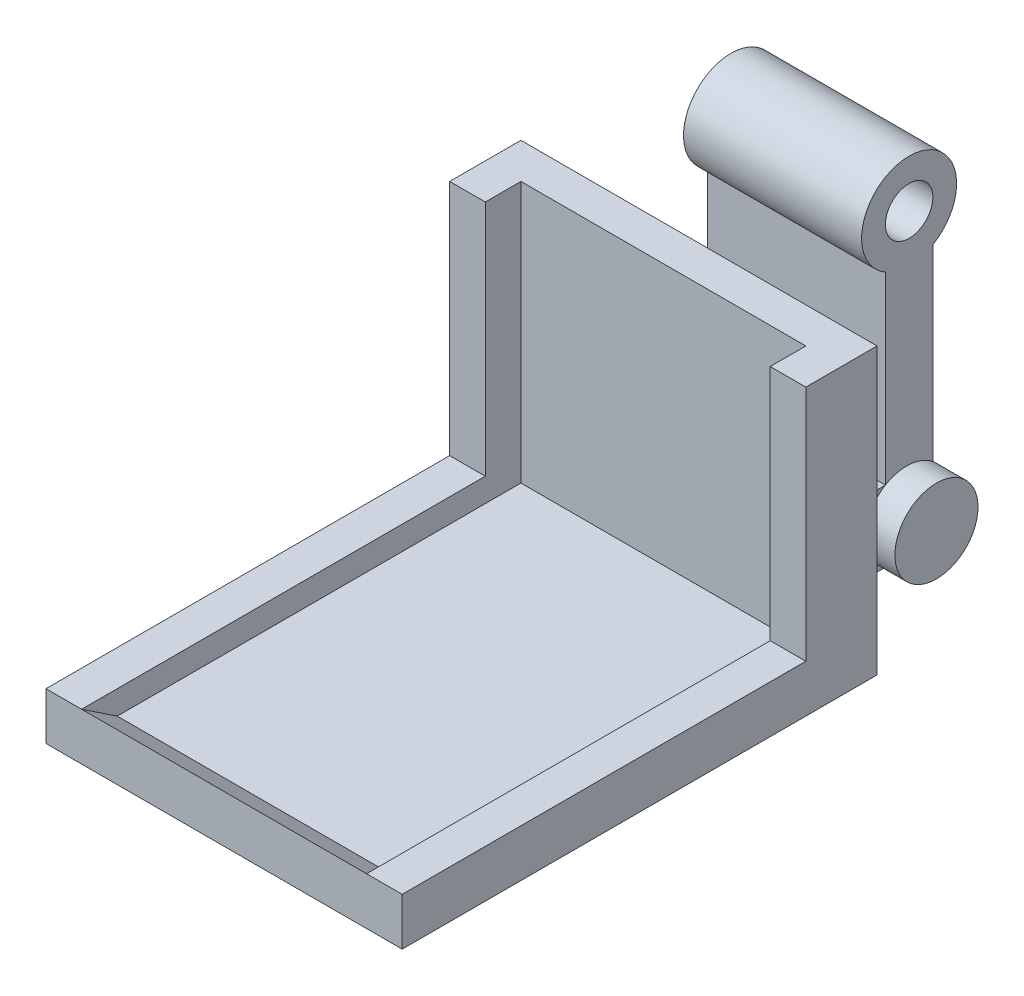
ISO-10303-21;
HEADER;
FILE_DESCRIPTION(('STEP AP214'),'2;1');
FILE_NAME('part.step','',(''),(''),'','','');
FILE_SCHEMA(('AUTOMOTIVE_DESIGN { 1 0 10303 214 1 1 1 1 }'));
ENDSEC;
DATA;
#1=APPLICATION_CONTEXT('core data for automotive mechanical design processes');
#2=APPLICATION_PROTOCOL_DEFINITION('international standard','automotive_design',2000,#1);
#3=PRODUCT_CONTEXT('',#1,'mechanical');
#4=PRODUCT('Part','Part','',(#3));
#5=PRODUCT_RELATED_PRODUCT_CATEGORY('part','',(#4));
#6=PRODUCT_DEFINITION_FORMATION('','',#4);
#7=PRODUCT_DEFINITION_CONTEXT('part definition',#1,'design');
#8=PRODUCT_DEFINITION('design','',#6,#7);
#9=PRODUCT_DEFINITION_SHAPE('','',#8);
#10=(LENGTH_UNIT() NAMED_UNIT(*) SI_UNIT(.MILLI.,.METRE.));
#11=(NAMED_UNIT(*) PLANE_ANGLE_UNIT() SI_UNIT($,.RADIAN.));
#12=(NAMED_UNIT(*) SI_UNIT($,.STERADIAN.) SOLID_ANGLE_UNIT());
#13=UNCERTAINTY_MEASURE_WITH_UNIT(LENGTH_MEASURE(1.E-05),#10,'distance_accuracy_value','');
#14=(GEOMETRIC_REPRESENTATION_CONTEXT(3) GLOBAL_UNCERTAINTY_ASSIGNED_CONTEXT((#13)) GLOBAL_UNIT_ASSIGNED_CONTEXT((#10,
#11,#12)) REPRESENTATION_CONTEXT('',''));
#15=CARTESIAN_POINT('',(0.,0.,0.));
#16=DIRECTION('',(0.,0.,1.));
#17=DIRECTION('',(1.,0.,0.));
#18=AXIS2_PLACEMENT_3D('',#15,#16,#17);
#19=CARTESIAN_POINT('',(10.,0.,0.));
#20=DIRECTION('',(-1.,0.,0.));
#21=DIRECTION('',(0.,0.,1.));
#22=AXIS2_PLACEMENT_3D('',#19,#20,#21);
#23=CYLINDRICAL_SURFACE('',#22,1.75);
#24=CARTESIAN_POINT('',(10.,0.,0.));
#25=DIRECTION('',(1.,0.,0.));
#26=DIRECTION('',(0.,0.,-1.));
#27=AXIS2_PLACEMENT_3D('',#24,#25,#26);
#28=CIRCLE('',#27,1.75);
#29=CARTESIAN_POINT('',(10.,0.,-1.75));
#30=VERTEX_POINT('',#29);
#31=EDGE_CURVE('E192',#30,#30,#28,.T.);
#32=ORIENTED_EDGE('',*,*,#31,.F.);
#33=EDGE_LOOP('',(#32));
#34=FACE_BOUND('',#33,.T.);
#35=CARTESIAN_POINT('',(0.,0.,0.));
#36=DIRECTION('',(1.,0.,0.));
#37=DIRECTION('',(0.,0.,-1.));
#38=AXIS2_PLACEMENT_3D('',#35,#36,#37);
#39=CIRCLE('',#38,1.75);
#40=CARTESIAN_POINT('',(0.,0.,-1.75));
#41=VERTEX_POINT('',#40);
#42=EDGE_CURVE('E227',#41,#41,#39,.T.);
#43=ORIENTED_EDGE('',*,*,#42,.T.);
#44=EDGE_LOOP('',(#43));
#45=FACE_BOUND('',#44,.T.);
#46=CARTESIAN_POINT('',(1.25,0.,0.));
#47=DIRECTION('',(1.,0.,0.));
#48=DIRECTION('',(0.,0.,-1.));
#49=AXIS2_PLACEMENT_3D('',#46,#47,#48);
#50=CIRCLE('',#49,1.75);
#51=CARTESIAN_POINT('',(1.25,1.36218621174346,-1.09861218113401));
#52=VERTEX_POINT('',#51);
#53=CARTESIAN_POINT('',(1.25,1.5,0.901387818865995));
#54=VERTEX_POINT('',#53);
#55=EDGE_CURVE('E11',#52,#54,#50,.T.);
#56=ORIENTED_EDGE('',*,*,#55,.F.);
#57=DIRECTION('',(-1.,0.,0.));
#58=VECTOR('',#57,1.);
#59=CARTESIAN_POINT('',(10.,1.36218621174346,-1.09861218113401));
#60=LINE('',#59,#58);
#61=CARTESIAN_POINT('',(8.75,1.36218621174346,-1.09861218113401));
#62=VERTEX_POINT('',#61);
#63=EDGE_CURVE('E198',#62,#52,#60,.T.);
#64=ORIENTED_EDGE('',*,*,#63,.F.);
#65=CARTESIAN_POINT('',(8.75,0.,0.));
#66=DIRECTION('',(-1.,0.,0.));
#67=DIRECTION('',(0.,0.,1.));
#68=AXIS2_PLACEMENT_3D('',#65,#66,#67);
#69=CIRCLE('',#68,1.75);
#70=CARTESIAN_POINT('',(8.75,1.5,0.901387818865994));
#71=VERTEX_POINT('',#70);
#72=EDGE_CURVE('E48',#71,#62,#69,.T.);
#73=ORIENTED_EDGE('',*,*,#72,.F.);
#74=CARTESIAN_POINT('',(8.75,0.,0.));
#75=DIRECTION('',(-1.,0.,0.));
#76=DIRECTION('',(0.,0.,1.));
#77=AXIS2_PLACEMENT_3D('',#74,#75,#76);
#78=CIRCLE('',#77,1.75);
#79=CARTESIAN_POINT('',(8.75,-1.5,0.901387818866004));
#80=VERTEX_POINT('',#79);
#81=EDGE_CURVE('E191',#80,#71,#78,.T.);
#82=ORIENTED_EDGE('',*,*,#81,.F.);
#83=DIRECTION('',(-1.,0.,0.));
#84=VECTOR('',#83,1.);
#85=CARTESIAN_POINT('',(10.,-1.5,0.901387818866005));
#86=LINE('',#85,#84);
#87=CARTESIAN_POINT('',(1.25,-1.5,0.901387818866005));
#88=VERTEX_POINT('',#87);
#89=EDGE_CURVE('E210',#88,#80,#86,.F.);
#90=ORIENTED_EDGE('',*,*,#89,.F.);
#91=CARTESIAN_POINT('',(1.25,0.,0.));
#92=DIRECTION('',(1.,0.,0.));
#93=DIRECTION('',(0.,0.,-1.));
#94=AXIS2_PLACEMENT_3D('',#91,#92,#93);
#95=CIRCLE('',#94,1.75);
#96=EDGE_CURVE('E236',#54,#88,#95,.T.);
#97=ORIENTED_EDGE('',*,*,#96,.F.);
#98=EDGE_LOOP('',(#56,#64,#73,#82,#90,#97));
#99=FACE_BOUND('',#98,.T.);
#100=ADVANCED_FACE('F39',(#34,#45,#99),#23,.T.);
#101=CARTESIAN_POINT('',(-2.5,0.500000000000001,25.));
#102=DIRECTION('',(0.,-1.,0.));
#103=DIRECTION('',(1.,0.,0.));
#104=AXIS2_PLACEMENT_3D('',#101,#102,#103);
#105=PLANE('',#104);
#106=DIRECTION('',(1.,0.,0.));
#107=VECTOR('',#106,1.);
#108=CARTESIAN_POINT('',(-1.,0.500000000000001,8.));
#109=LINE('',#108,#107);
#110=CARTESIAN_POINT('',(-2.5,0.500000000000001,8.));
#111=VERTEX_POINT('',#110);
#112=CARTESIAN_POINT('',(-1.,0.500000000000001,8.));
#113=VERTEX_POINT('',#112);
#114=EDGE_CURVE('E259',#111,#113,#109,.T.);
#115=ORIENTED_EDGE('',*,*,#114,.F.);
#116=DIRECTION('',(0.,0.,-1.));
#117=VECTOR('',#116,1.);
#118=CARTESIAN_POINT('',(-2.5,0.500000000000001,25.));
#119=LINE('',#118,#117);
#120=CARTESIAN_POINT('',(-2.5,0.500000000000001,25.));
#121=VERTEX_POINT('',#120);
#122=EDGE_CURVE('E366',#121,#111,#119,.T.);
#123=ORIENTED_EDGE('',*,*,#122,.F.);
#124=DIRECTION('',(-1.,0.,0.));
#125=VECTOR('',#124,1.);
#126=CARTESIAN_POINT('',(-2.5,0.500000000000001,25.));
#127=LINE('',#126,#125);
#128=CARTESIAN_POINT('',(-1.,0.499999999999996,25.));
#129=VERTEX_POINT('',#128);
#130=EDGE_CURVE('E361',#129,#121,#127,.T.);
#131=ORIENTED_EDGE('',*,*,#130,.F.);
#132=DIRECTION('',(0.,0.,1.));
#133=VECTOR('',#132,1.);
#134=CARTESIAN_POINT('',(-1.,0.500000000000001,6.5));
#135=LINE('',#134,#133);
#136=EDGE_CURVE('E320',#113,#129,#135,.T.);
#137=ORIENTED_EDGE('',*,*,#136,.F.);
#138=EDGE_LOOP('',(#115,#123,#131,#137));
#139=FACE_BOUND('',#138,.T.);
#140=ADVANCED_FACE('F425',(#139),#105,.F.);
#141=DIRECTION('',(1.,0.,0.));
#142=VECTOR('',#141,1.);
#143=CARTESIAN_POINT('',(12.5,0.500000000000004,8.));
#144=LINE('',#143,#142);
#145=CARTESIAN_POINT('',(11.,0.500000000000003,8.));
#146=VERTEX_POINT('',#145);
#147=CARTESIAN_POINT('',(12.5,0.500000000000004,8.));
#148=VERTEX_POINT('',#147);
#149=EDGE_CURVE('E265',#146,#148,#144,.T.);
#150=ORIENTED_EDGE('',*,*,#149,.F.);
#151=DIRECTION('',(0.,0.,-1.));
#152=VECTOR('',#151,1.);
#153=CARTESIAN_POINT('',(11.,0.500000000000003,6.5));
#154=LINE('',#153,#152);
#155=CARTESIAN_POINT('',(11.,0.499999999999998,25.));
#156=VERTEX_POINT('',#155);
#157=EDGE_CURVE('E326',#156,#146,#154,.T.);
#158=ORIENTED_EDGE('',*,*,#157,.F.);
#159=CARTESIAN_POINT('',(12.5,0.500000000000004,25.));
#160=VERTEX_POINT('',#159);
#161=EDGE_CURVE('E362',#160,#156,#127,.T.);
#162=ORIENTED_EDGE('',*,*,#161,.F.);
#163=DIRECTION('',(0.,0.,-1.));
#164=VECTOR('',#163,1.);
#165=CARTESIAN_POINT('',(12.5,0.500000000000004,25.));
#166=LINE('',#165,#164);
#167=EDGE_CURVE('E380',#160,#148,#166,.T.);
#168=ORIENTED_EDGE('',*,*,#167,.T.);
#169=EDGE_LOOP('',(#150,#158,#162,#168));
#170=FACE_BOUND('',#169,.T.);
#171=ADVANCED_FACE('F462',(#170),#105,.F.);
#172=CARTESIAN_POINT('',(10.,0.,0.));
#173=DIRECTION('',(1.,0.,0.));
#174=DIRECTION('',(0.,0.,-1.));
#175=AXIS2_PLACEMENT_3D('',#172,#173,#174);
#176=PLANE('',#175);
#177=ORIENTED_EDGE('',*,*,#31,.T.);
#178=EDGE_LOOP('',(#177));
#179=FACE_BOUND('',#178,.T.);
#180=ADVANCED_FACE('F464',(#179),#176,.T.);
#181=CARTESIAN_POINT('',(0.,0.,0.));
#182=DIRECTION('',(1.,0.,0.));
#183=DIRECTION('',(0.,0.,-1.));
#184=AXIS2_PLACEMENT_3D('',#181,#182,#183);
#185=PLANE('',#184);
#186=ORIENTED_EDGE('',*,*,#42,.F.);
#187=EDGE_LOOP('',(#186));
#188=FACE_BOUND('',#187,.T.);
#189=ADVANCED_FACE('F470',(#188),#185,.F.);
#190=CARTESIAN_POINT('',(1.25,-1.5,5.));
#191=DIRECTION('',(0.,1.,0.));
#192=DIRECTION('',(-1.,0.,0.));
#193=AXIS2_PLACEMENT_3D('',#190,#191,#192);
#194=PLANE('',#193);
#195=DIRECTION('',(0.,0.,-1.));
#196=VECTOR('',#195,1.);
#197=CARTESIAN_POINT('',(1.25,-1.5,5.));
#198=LINE('',#197,#196);
#199=CARTESIAN_POINT('',(1.25,-1.5,5.));
#200=VERTEX_POINT('',#199);
#201=EDGE_CURVE('E219',#200,#88,#198,.T.);
#202=ORIENTED_EDGE('',*,*,#201,.T.);
#203=ORIENTED_EDGE('',*,*,#89,.T.);
#204=DIRECTION('',(0.,0.,-1.));
#205=VECTOR('',#204,1.);
#206=CARTESIAN_POINT('',(8.75,-1.5,5.));
#207=LINE('',#206,#205);
#208=CARTESIAN_POINT('',(8.75,-1.5,5.));
#209=VERTEX_POINT('',#208);
#210=EDGE_CURVE('E208',#209,#80,#207,.T.);
#211=ORIENTED_EDGE('',*,*,#210,.F.);
#212=DIRECTION('',(1.,0.,0.));
#213=VECTOR('',#212,1.);
#214=CARTESIAN_POINT('',(-2.5,-1.5,5.));
#215=LINE('',#214,#213);
#216=CARTESIAN_POINT('',(12.5,-1.5,5.));
#217=VERTEX_POINT('',#216);
#218=EDGE_CURVE('E370',#209,#217,#215,.T.);
#219=ORIENTED_EDGE('',*,*,#218,.T.);
#220=DIRECTION('',(0.,0.,-1.));
#221=VECTOR('',#220,1.);
#222=CARTESIAN_POINT('',(12.5,-1.5,25.));
#223=LINE('',#222,#221);
#224=CARTESIAN_POINT('',(12.5,-1.5,25.));
#225=VERTEX_POINT('',#224);
#226=EDGE_CURVE('E384',#225,#217,#223,.T.);
#227=ORIENTED_EDGE('',*,*,#226,.F.);
#228=DIRECTION('',(1.,0.,0.));
#229=VECTOR('',#228,1.);
#230=CARTESIAN_POINT('',(-2.5,-1.5,25.));
#231=LINE('',#230,#229);
#232=CARTESIAN_POINT('',(-2.5,-1.5,25.));
#233=VERTEX_POINT('',#232);
#234=EDGE_CURVE('E354',#233,#225,#231,.T.);
#235=ORIENTED_EDGE('',*,*,#234,.F.);
#236=DIRECTION('',(0.,0.,-1.));
#237=VECTOR('',#236,1.);
#238=CARTESIAN_POINT('',(-2.5,-1.5,25.));
#239=LINE('',#238,#237);
#240=CARTESIAN_POINT('',(-2.5,-1.5,5.));
#241=VERTEX_POINT('',#240);
#242=EDGE_CURVE('E388',#233,#241,#239,.T.);
#243=ORIENTED_EDGE('',*,*,#242,.T.);
#244=EDGE_CURVE('E371',#241,#200,#215,.T.);
#245=ORIENTED_EDGE('',*,*,#244,.T.);
#246=EDGE_LOOP('',(#202,#203,#211,#219,#227,#235,#243,#245));
#247=FACE_BOUND('',#246,.T.);
#248=ADVANCED_FACE('F406',(#247),#194,.F.);
#249=CARTESIAN_POINT('',(1.25,1.5,5.));
#250=DIRECTION('',(0.,-1.,0.));
#251=DIRECTION('',(1.,0.,0.));
#252=AXIS2_PLACEMENT_3D('',#249,#250,#251);
#253=PLANE('',#252);
#254=DIRECTION('',(0.,0.,-1.));
#255=VECTOR('',#254,1.);
#256=CARTESIAN_POINT('',(8.75,1.5,5.));
#257=LINE('',#256,#255);
#258=CARTESIAN_POINT('',(8.75,1.5,5.));
#259=VERTEX_POINT('',#258);
#260=EDGE_CURVE('E206',#259,#71,#257,.T.);
#261=ORIENTED_EDGE('',*,*,#260,.T.);
#262=DIRECTION('',(-1.,0.,0.));
#263=VECTOR('',#262,1.);
#264=CARTESIAN_POINT('',(10.,1.5,0.901387818865995));
#265=LINE('',#264,#263);
#266=EDGE_CURVE('E184',#71,#54,#265,.T.);
#267=ORIENTED_EDGE('',*,*,#266,.T.);
#268=DIRECTION('',(0.,0.,-1.));
#269=VECTOR('',#268,1.);
#270=CARTESIAN_POINT('',(1.25,1.5,5.));
#271=LINE('',#270,#269);
#272=CARTESIAN_POINT('',(1.25,1.5,5.));
#273=VERTEX_POINT('',#272);
#274=EDGE_CURVE('E215',#273,#54,#271,.T.);
#275=ORIENTED_EDGE('',*,*,#274,.F.);
#276=DIRECTION('',(-1.,0.,0.));
#277=VECTOR('',#276,1.);
#278=CARTESIAN_POINT('',(1.25,1.5,5.));
#279=LINE('',#278,#277);
#280=EDGE_CURVE('E213',#259,#273,#279,.T.);
#281=ORIENTED_EDGE('',*,*,#280,.F.);
#282=EDGE_LOOP('',(#261,#267,#275,#281));
#283=FACE_BOUND('',#282,.T.);
#284=ADVANCED_FACE('F212',(#283),#253,.F.);
#285=CARTESIAN_POINT('',(1.25,1.5,5.));
#286=DIRECTION('',(1.,0.,0.));
#287=DIRECTION('',(0.,0.,-1.));
#288=AXIS2_PLACEMENT_3D('',#285,#286,#287);
#289=PLANE('',#288);
#290=ORIENTED_EDGE('',*,*,#274,.T.);
#291=ORIENTED_EDGE('',*,*,#96,.T.);
#292=ORIENTED_EDGE('',*,*,#201,.F.);
#293=DIRECTION('',(0.,-1.,0.));
#294=VECTOR('',#293,1.);
#295=CARTESIAN_POINT('',(1.25,1.5,5.));
#296=LINE('',#295,#294);
#297=EDGE_CURVE('E392',#273,#200,#296,.T.);
#298=ORIENTED_EDGE('',*,*,#297,.F.);
#299=EDGE_LOOP('',(#290,#291,#292,#298));
#300=FACE_BOUND('',#299,.T.);
#301=ADVANCED_FACE('F404',(#300),#289,.F.);
#302=CARTESIAN_POINT('',(8.75,1.5,5.));
#303=DIRECTION('',(-1.,0.,0.));
#304=DIRECTION('',(0.,0.,1.));
#305=AXIS2_PLACEMENT_3D('',#302,#303,#304);
#306=PLANE('',#305);
#307=ORIENTED_EDGE('',*,*,#210,.T.);
#308=ORIENTED_EDGE('',*,*,#81,.T.);
#309=ORIENTED_EDGE('',*,*,#260,.F.);
#310=DIRECTION('',(0.,1.,0.));
#311=VECTOR('',#310,1.);
#312=CARTESIAN_POINT('',(8.75,1.5,5.));
#313=LINE('',#312,#311);
#314=EDGE_CURVE('E395',#209,#259,#313,.T.);
#315=ORIENTED_EDGE('',*,*,#314,.F.);
#316=EDGE_LOOP('',(#307,#308,#309,#315));
#317=FACE_BOUND('',#316,.T.);
#318=ADVANCED_FACE('F204',(#317),#306,.F.);
#319=CARTESIAN_POINT('',(0.,0.,5.));
#320=DIRECTION('',(0.,0.,1.));
#321=DIRECTION('',(1.,0.,0.));
#322=AXIS2_PLACEMENT_3D('',#319,#320,#321);
#323=PLANE('',#322);
#324=DIRECTION('',(0.,-1.,0.));
#325=VECTOR('',#324,1.);
#326=CARTESIAN_POINT('',(-2.5,0.500000000000001,5.));
#327=LINE('',#326,#325);
#328=CARTESIAN_POINT('',(-2.5,10.5,5.));
#329=VERTEX_POINT('',#328);
#330=EDGE_CURVE('E347',#329,#241,#327,.T.);
#331=ORIENTED_EDGE('',*,*,#330,.F.);
#332=DIRECTION('',(-1.,0.,0.));
#333=VECTOR('',#332,1.);
#334=CARTESIAN_POINT('',(-2.5,10.5,5.));
#335=LINE('',#334,#333);
#336=CARTESIAN_POINT('',(12.5,10.5,5.));
#337=VERTEX_POINT('',#336);
#338=EDGE_CURVE('E286',#337,#329,#335,.T.);
#339=ORIENTED_EDGE('',*,*,#338,.F.);
#340=DIRECTION('',(0.,1.,0.));
#341=VECTOR('',#340,1.);
#342=CARTESIAN_POINT('',(12.5,0.500000000000004,5.));
#343=LINE('',#342,#341);
#344=EDGE_CURVE('E355',#217,#337,#343,.T.);
#345=ORIENTED_EDGE('',*,*,#344,.F.);
#346=ORIENTED_EDGE('',*,*,#218,.F.);
#347=ORIENTED_EDGE('',*,*,#314,.T.);
#348=ORIENTED_EDGE('',*,*,#280,.T.);
#349=ORIENTED_EDGE('',*,*,#297,.T.);
#350=ORIENTED_EDGE('',*,*,#244,.F.);
#351=EDGE_LOOP('',(#331,#339,#345,#346,#347,#348,#349,#350));
#352=FACE_BOUND('',#351,.T.);
#353=ADVANCED_FACE('F399',(#352),#323,.F.);
#354=CARTESIAN_POINT('',(-2.5,0.500000000000001,25.));
#355=DIRECTION('',(1.,0.,0.));
#356=DIRECTION('',(0.,0.,-1.));
#357=AXIS2_PLACEMENT_3D('',#354,#355,#356);
#358=PLANE('',#357);
#359=ORIENTED_EDGE('',*,*,#330,.T.);
#360=ORIENTED_EDGE('',*,*,#242,.F.);
#361=DIRECTION('',(0.,-1.,0.));
#362=VECTOR('',#361,1.);
#363=CARTESIAN_POINT('',(-2.5,0.500000000000001,25.));
#364=LINE('',#363,#362);
#365=EDGE_CURVE('E350',#121,#233,#364,.T.);
#366=ORIENTED_EDGE('',*,*,#365,.F.);
#367=ORIENTED_EDGE('',*,*,#122,.T.);
#368=DIRECTION('',(0.,-1.,0.));
#369=VECTOR('',#368,1.);
#370=CARTESIAN_POINT('',(-2.5,10.5,8.));
#371=LINE('',#370,#369);
#372=CARTESIAN_POINT('',(-2.5,10.5,8.));
#373=VERTEX_POINT('',#372);
#374=EDGE_CURVE('E305',#373,#111,#371,.T.);
#375=ORIENTED_EDGE('',*,*,#374,.F.);
#376=DIRECTION('',(0.,0.,1.));
#377=VECTOR('',#376,1.);
#378=CARTESIAN_POINT('',(-2.5,10.5,8.));
#379=LINE('',#378,#377);
#380=EDGE_CURVE('E260',#329,#373,#379,.T.);
#381=ORIENTED_EDGE('',*,*,#380,.F.);
#382=EDGE_LOOP('',(#359,#360,#366,#367,#375,#381));
#383=FACE_BOUND('',#382,.T.);
#384=ADVANCED_FACE('F416',(#383),#358,.F.);
#385=CARTESIAN_POINT('',(12.5,0.500000000000004,25.));
#386=DIRECTION('',(-1.,0.,0.));
#387=DIRECTION('',(0.,0.,1.));
#388=AXIS2_PLACEMENT_3D('',#385,#386,#387);
#389=PLANE('',#388);
#390=ORIENTED_EDGE('',*,*,#344,.T.);
#391=DIRECTION('',(0.,0.,-1.));
#392=VECTOR('',#391,1.);
#393=CARTESIAN_POINT('',(12.5,10.5,5.));
#394=LINE('',#393,#392);
#395=CARTESIAN_POINT('',(12.5,10.5,8.));
#396=VERTEX_POINT('',#395);
#397=EDGE_CURVE('E282',#396,#337,#394,.T.);
#398=ORIENTED_EDGE('',*,*,#397,.F.);
#399=DIRECTION('',(0.,-1.,0.));
#400=VECTOR('',#399,1.);
#401=CARTESIAN_POINT('',(12.5,10.5,8.));
#402=LINE('',#401,#400);
#403=EDGE_CURVE('E290',#396,#148,#402,.T.);
#404=ORIENTED_EDGE('',*,*,#403,.T.);
#405=ORIENTED_EDGE('',*,*,#167,.F.);
#406=DIRECTION('',(0.,1.,0.));
#407=VECTOR('',#406,1.);
#408=CARTESIAN_POINT('',(12.5,0.500000000000004,25.));
#409=LINE('',#408,#407);
#410=EDGE_CURVE('E358',#225,#160,#409,.T.);
#411=ORIENTED_EDGE('',*,*,#410,.F.);
#412=ORIENTED_EDGE('',*,*,#226,.T.);
#413=EDGE_LOOP('',(#390,#398,#404,#405,#411,#412));
#414=FACE_BOUND('',#413,.T.);
#415=ADVANCED_FACE('F453',(#414),#389,.F.);
#416=CARTESIAN_POINT('',(0.,0.,25.));
#417=DIRECTION('',(0.,0.,1.));
#418=DIRECTION('',(1.,0.,0.));
#419=AXIS2_PLACEMENT_3D('',#416,#417,#418);
#420=PLANE('',#419);
#421=ORIENTED_EDGE('',*,*,#365,.T.);
#422=ORIENTED_EDGE('',*,*,#234,.T.);
#423=ORIENTED_EDGE('',*,*,#410,.T.);
#424=ORIENTED_EDGE('',*,*,#161,.T.);
#425=DIRECTION('',(1.,0.,0.));
#426=VECTOR('',#425,1.);
#427=CARTESIAN_POINT('',(-1.,0.499999999999996,25.));
#428=LINE('',#427,#426);
#429=EDGE_CURVE('E313',#129,#156,#428,.T.);
#430=ORIENTED_EDGE('',*,*,#429,.F.);
#431=ORIENTED_EDGE('',*,*,#130,.T.);
#432=EDGE_LOOP('',(#421,#422,#423,#424,#430,#431));
#433=FACE_BOUND('',#432,.T.);
#434=ADVANCED_FACE('F459',(#433),#420,.T.);
#435=CARTESIAN_POINT('',(-1.,-0.499999999999999,6.5));
#436=DIRECTION('',(-1.,0.,0.));
#437=DIRECTION('',(0.,-1.,0.));
#438=AXIS2_PLACEMENT_3D('',#435,#436,#437);
#439=PLANE('',#438);
#440=DIRECTION('',(0.,1.,0.));
#441=VECTOR('',#440,1.);
#442=CARTESIAN_POINT('',(-1.,-0.499999999999999,6.5));
#443=LINE('',#442,#441);
#444=CARTESIAN_POINT('',(-1.,-0.499999999999999,6.5));
#445=VERTEX_POINT('',#444);
#446=CARTESIAN_POINT('',(-1.,10.5,6.5));
#447=VERTEX_POINT('',#446);
#448=EDGE_CURVE('E344',#445,#447,#443,.T.);
#449=ORIENTED_EDGE('',*,*,#448,.T.);
#450=DIRECTION('',(0.,0.,-1.));
#451=VECTOR('',#450,1.);
#452=CARTESIAN_POINT('',(-1.,10.5,6.5));
#453=LINE('',#452,#451);
#454=CARTESIAN_POINT('',(-1.,10.5,8.));
#455=VERTEX_POINT('',#454);
#456=EDGE_CURVE('E268',#455,#447,#453,.T.);
#457=ORIENTED_EDGE('',*,*,#456,.F.);
#458=DIRECTION('',(0.,-1.,0.));
#459=VECTOR('',#458,1.);
#460=CARTESIAN_POINT('',(-1.,10.5,8.));
#461=LINE('',#460,#459);
#462=EDGE_CURVE('E301',#455,#113,#461,.T.);
#463=ORIENTED_EDGE('',*,*,#462,.T.);
#464=ORIENTED_EDGE('',*,*,#136,.T.);
#465=DIRECTION('',(0.,0.554700196225227,0.832050294337845));
#466=VECTOR('',#465,1.);
#467=CARTESIAN_POINT('',(-1.,-0.499999999999999,23.5));
#468=LINE('',#467,#466);
#469=CARTESIAN_POINT('',(-1.,-0.499999999999999,23.5));
#470=VERTEX_POINT('',#469);
#471=EDGE_CURVE('E309',#470,#129,#468,.T.);
#472=ORIENTED_EDGE('',*,*,#471,.F.);
#473=DIRECTION('',(0.,0.,1.));
#474=VECTOR('',#473,1.);
#475=CARTESIAN_POINT('',(-1.,-0.499999999999999,6.5));
#476=LINE('',#475,#474);
#477=EDGE_CURVE('E321',#445,#470,#476,.T.);
#478=ORIENTED_EDGE('',*,*,#477,.F.);
#479=EDGE_LOOP('',(#449,#457,#463,#464,#472,#478));
#480=FACE_BOUND('',#479,.T.);
#481=ADVANCED_FACE('F429',(#480),#439,.F.);
#482=CARTESIAN_POINT('',(-1.,-0.499999999999999,6.5));
#483=DIRECTION('',(0.,0.,-1.));
#484=DIRECTION('',(-1.,0.,0.));
#485=AXIS2_PLACEMENT_3D('',#482,#483,#484);
#486=PLANE('',#485);
#487=DIRECTION('',(0.,1.,0.));
#488=VECTOR('',#487,1.);
#489=CARTESIAN_POINT('',(11.,-0.499999999999997,6.5));
#490=LINE('',#489,#488);
#491=CARTESIAN_POINT('',(11.,-0.499999999999997,6.5));
#492=VERTEX_POINT('',#491);
#493=CARTESIAN_POINT('',(11.,10.5,6.5));
#494=VERTEX_POINT('',#493);
#495=EDGE_CURVE('E338',#492,#494,#490,.T.);
#496=ORIENTED_EDGE('',*,*,#495,.T.);
#497=DIRECTION('',(1.,0.,0.));
#498=VECTOR('',#497,1.);
#499=CARTESIAN_POINT('',(11.,10.5,6.5));
#500=LINE('',#499,#498);
#501=EDGE_CURVE('E272',#447,#494,#500,.T.);
#502=ORIENTED_EDGE('',*,*,#501,.F.);
#503=ORIENTED_EDGE('',*,*,#448,.F.);
#504=DIRECTION('',(-1.,0.,0.));
#505=VECTOR('',#504,1.);
#506=CARTESIAN_POINT('',(-1.,-0.499999999999999,6.5));
#507=LINE('',#506,#505);
#508=EDGE_CURVE('E334',#492,#445,#507,.T.);
#509=ORIENTED_EDGE('',*,*,#508,.F.);
#510=EDGE_LOOP('',(#496,#502,#503,#509));
#511=FACE_BOUND('',#510,.T.);
#512=ADVANCED_FACE('F442',(#511),#486,.F.);
#513=CARTESIAN_POINT('',(11.,-0.499999999999997,6.5));
#514=DIRECTION('',(1.,0.,0.));
#515=DIRECTION('',(0.,1.,0.));
#516=AXIS2_PLACEMENT_3D('',#513,#514,#515);
#517=PLANE('',#516);
#518=ORIENTED_EDGE('',*,*,#157,.T.);
#519=DIRECTION('',(0.,-1.,0.));
#520=VECTOR('',#519,1.);
#521=CARTESIAN_POINT('',(11.,10.5,8.));
#522=LINE('',#521,#520);
#523=CARTESIAN_POINT('',(11.,10.5,8.));
#524=VERTEX_POINT('',#523);
#525=EDGE_CURVE('E298',#524,#146,#522,.T.);
#526=ORIENTED_EDGE('',*,*,#525,.F.);
#527=DIRECTION('',(0.,0.,1.));
#528=VECTOR('',#527,1.);
#529=CARTESIAN_POINT('',(11.,10.5,8.));
#530=LINE('',#529,#528);
#531=EDGE_CURVE('E276',#494,#524,#530,.T.);
#532=ORIENTED_EDGE('',*,*,#531,.F.);
#533=ORIENTED_EDGE('',*,*,#495,.F.);
#534=DIRECTION('',(0.,0.,-1.));
#535=VECTOR('',#534,1.);
#536=CARTESIAN_POINT('',(11.,-0.499999999999997,6.5));
#537=LINE('',#536,#535);
#538=CARTESIAN_POINT('',(11.,-0.499999999999997,23.5));
#539=VERTEX_POINT('',#538);
#540=EDGE_CURVE('E330',#539,#492,#537,.T.);
#541=ORIENTED_EDGE('',*,*,#540,.F.);
#542=DIRECTION('',(0.,0.554700196225227,0.832050294337845));
#543=VECTOR('',#542,1.);
#544=CARTESIAN_POINT('',(11.,-0.499999999999997,23.5));
#545=LINE('',#544,#543);
#546=EDGE_CURVE('E308',#539,#156,#545,.T.);
#547=ORIENTED_EDGE('',*,*,#546,.T.);
#548=EDGE_LOOP('',(#518,#526,#532,#533,#541,#547));
#549=FACE_BOUND('',#548,.T.);
#550=ADVANCED_FACE('F444',(#549),#517,.F.);
#551=CARTESIAN_POINT('',(0.,-0.499999999999999,0.));
#552=DIRECTION('',(0.,1.,0.));
#553=DIRECTION('',(-1.,0.,0.));
#554=AXIS2_PLACEMENT_3D('',#551,#552,#553);
#555=PLANE('',#554);
#556=ORIENTED_EDGE('',*,*,#477,.T.);
#557=DIRECTION('',(1.,0.,0.));
#558=VECTOR('',#557,1.);
#559=CARTESIAN_POINT('',(-0.999999999999998,-0.499999999999999,23.5));
#560=LINE('',#559,#558);
#561=EDGE_CURVE('E325',#470,#539,#560,.T.);
#562=ORIENTED_EDGE('',*,*,#561,.T.);
#563=ORIENTED_EDGE('',*,*,#540,.T.);
#564=ORIENTED_EDGE('',*,*,#508,.T.);
#565=EDGE_LOOP('',(#556,#562,#563,#564));
#566=FACE_BOUND('',#565,.T.);
#567=ADVANCED_FACE('F437',(#566),#555,.T.);
#568=CARTESIAN_POINT('',(-1.,-0.499999999999999,23.5));
#569=DIRECTION('',(0.,0.832050294337845,-0.554700196225227));
#570=DIRECTION('',(0.,0.554700196225227,0.832050294337845));
#571=AXIS2_PLACEMENT_3D('',#568,#569,#570);
#572=PLANE('',#571);
#573=ORIENTED_EDGE('',*,*,#546,.F.);
#574=ORIENTED_EDGE('',*,*,#561,.F.);
#575=ORIENTED_EDGE('',*,*,#471,.T.);
#576=ORIENTED_EDGE('',*,*,#429,.T.);
#577=EDGE_LOOP('',(#573,#574,#575,#576));
#578=FACE_BOUND('',#577,.T.);
#579=ADVANCED_FACE('F434',(#578),#572,.T.);
#580=CARTESIAN_POINT('',(-1.,10.5,8.));
#581=DIRECTION('',(0.,0.,-1.));
#582=DIRECTION('',(-1.,0.,0.));
#583=AXIS2_PLACEMENT_3D('',#580,#581,#582);
#584=PLANE('',#583);
#585=ORIENTED_EDGE('',*,*,#114,.T.);
#586=ORIENTED_EDGE('',*,*,#462,.F.);
#587=DIRECTION('',(1.,0.,0.));
#588=VECTOR('',#587,1.);
#589=CARTESIAN_POINT('',(-1.,10.5,8.));
#590=LINE('',#589,#588);
#591=EDGE_CURVE('E264',#373,#455,#590,.T.);
#592=ORIENTED_EDGE('',*,*,#591,.F.);
#593=ORIENTED_EDGE('',*,*,#374,.T.);
#594=EDGE_LOOP('',(#585,#586,#592,#593));
#595=FACE_BOUND('',#594,.T.);
#596=ADVANCED_FACE('F421',(#595),#584,.F.);
#597=CARTESIAN_POINT('',(12.5,10.5,8.));
#598=DIRECTION('',(0.,0.,-1.));
#599=DIRECTION('',(-1.,0.,0.));
#600=AXIS2_PLACEMENT_3D('',#597,#598,#599);
#601=PLANE('',#600);
#602=ORIENTED_EDGE('',*,*,#149,.T.);
#603=ORIENTED_EDGE('',*,*,#403,.F.);
#604=DIRECTION('',(1.,0.,0.));
#605=VECTOR('',#604,1.);
#606=CARTESIAN_POINT('',(12.5,10.5,8.));
#607=LINE('',#606,#605);
#608=EDGE_CURVE('E279',#524,#396,#607,.T.);
#609=ORIENTED_EDGE('',*,*,#608,.F.);
#610=ORIENTED_EDGE('',*,*,#525,.T.);
#611=EDGE_LOOP('',(#602,#603,#609,#610));
#612=FACE_BOUND('',#611,.T.);
#613=ADVANCED_FACE('F449',(#612),#601,.F.);
#614=CARTESIAN_POINT('',(0.,10.5,0.));
#615=DIRECTION('',(0.,-1.,0.));
#616=DIRECTION('',(1.,0.,0.));
#617=AXIS2_PLACEMENT_3D('',#614,#615,#616);
#618=PLANE('',#617);
#619=ORIENTED_EDGE('',*,*,#380,.T.);
#620=ORIENTED_EDGE('',*,*,#591,.T.);
#621=ORIENTED_EDGE('',*,*,#456,.T.);
#622=ORIENTED_EDGE('',*,*,#501,.T.);
#623=ORIENTED_EDGE('',*,*,#531,.T.);
#624=ORIENTED_EDGE('',*,*,#608,.T.);
#625=ORIENTED_EDGE('',*,*,#397,.T.);
#626=ORIENTED_EDGE('',*,*,#338,.T.);
#627=EDGE_LOOP('',(#619,#620,#621,#622,#623,#624,#625,#626));
#628=FACE_BOUND('',#627,.T.);
#629=ADVANCED_FACE('F413',(#628),#618,.F.);
#630=CARTESIAN_POINT('',(1.25,11.,-1.09861218113401));
#631=DIRECTION('',(0.,0.,1.));
#632=DIRECTION('',(1.,0.,0.));
#633=AXIS2_PLACEMENT_3D('',#630,#631,#632);
#634=PLANE('',#633);
#635=DIRECTION('',(0.,-1.,0.));
#636=VECTOR('',#635,1.);
#637=CARTESIAN_POINT('',(1.25,11.,-1.09861218113401));
#638=LINE('',#637,#636);
#639=CARTESIAN_POINT('',(1.25,9.26794919243112,-1.09861218113401));
#640=VERTEX_POINT('',#639);
#641=EDGE_CURVE('E63',#640,#52,#638,.T.);
#642=ORIENTED_EDGE('',*,*,#641,.F.);
#643=DIRECTION('',(-1.,0.,0.));
#644=VECTOR('',#643,1.);
#645=CARTESIAN_POINT('',(8.75,9.26794919243112,-1.09861218113401));
#646=LINE('',#645,#644);
#647=CARTESIAN_POINT('',(8.75,9.26794919243112,-1.09861218113401));
#648=VERTEX_POINT('',#647);
#649=EDGE_CURVE('E249',#640,#648,#646,.F.);
#650=ORIENTED_EDGE('',*,*,#649,.T.);
#651=DIRECTION('',(0.,-1.,0.));
#652=VECTOR('',#651,1.);
#653=CARTESIAN_POINT('',(8.75,11.,-1.09861218113401));
#654=LINE('',#653,#652);
#655=EDGE_CURVE('E181',#648,#62,#654,.T.);
#656=ORIENTED_EDGE('',*,*,#655,.T.);
#657=ORIENTED_EDGE('',*,*,#63,.T.);
#658=EDGE_LOOP('',(#642,#650,#656,#657));
#659=FACE_BOUND('',#658,.T.);
#660=ADVANCED_FACE('F241',(#659),#634,.F.);
#661=CARTESIAN_POINT('',(1.25,11.,0.901387818865994));
#662=DIRECTION('',(0.,0.,-1.));
#663=DIRECTION('',(-1.,0.,0.));
#664=AXIS2_PLACEMENT_3D('',#661,#662,#663);
#665=PLANE('',#664);
#666=DIRECTION('',(0.,-1.,0.));
#667=VECTOR('',#666,1.);
#668=CARTESIAN_POINT('',(8.75,11.,0.901387818865994));
#669=LINE('',#668,#667);
#670=CARTESIAN_POINT('',(8.75,9.26794919243112,0.901387818865994));
#671=VERTEX_POINT('',#670);
#672=EDGE_CURVE('E171',#671,#71,#669,.T.);
#673=ORIENTED_EDGE('',*,*,#672,.F.);
#674=DIRECTION('',(-1.,0.,0.));
#675=VECTOR('',#674,1.);
#676=CARTESIAN_POINT('',(8.75,9.26794919243112,0.901387818865994));
#677=LINE('',#676,#675);
#678=CARTESIAN_POINT('',(1.25,9.26794919243112,0.901387818865994));
#679=VERTEX_POINT('',#678);
#680=EDGE_CURVE('E55',#671,#679,#677,.T.);
#681=ORIENTED_EDGE('',*,*,#680,.T.);
#682=DIRECTION('',(0.,-1.,0.));
#683=VECTOR('',#682,1.);
#684=CARTESIAN_POINT('',(1.25,11.,0.901387818865994));
#685=LINE('',#684,#683);
#686=EDGE_CURVE('E180',#679,#54,#685,.T.);
#687=ORIENTED_EDGE('',*,*,#686,.T.);
#688=ORIENTED_EDGE('',*,*,#266,.F.);
#689=EDGE_LOOP('',(#673,#681,#687,#688));
#690=FACE_BOUND('',#689,.T.);
#691=ADVANCED_FACE('F185',(#690),#665,.F.);
#692=CARTESIAN_POINT('',(1.25,11.,0.901387818865994));
#693=DIRECTION('',(1.,0.,0.));
#694=DIRECTION('',(0.,0.,-1.));
#695=AXIS2_PLACEMENT_3D('',#692,#693,#694);
#696=PLANE('',#695);
#697=CARTESIAN_POINT('',(1.25,11.,-0.0986121811340059));
#698=DIRECTION('',(-1.,0.,0.));
#699=DIRECTION('',(0.,0.,1.));
#700=AXIS2_PLACEMENT_3D('',#697,#698,#699);
#701=CIRCLE('',#700,1.);
#702=CARTESIAN_POINT('',(1.25,11.,0.901387818865995));
#703=VERTEX_POINT('',#702);
#704=EDGE_CURVE('E722',#703,#703,#701,.T.);
#705=ORIENTED_EDGE('',*,*,#704,.F.);
#706=EDGE_LOOP('',(#705));
#707=FACE_BOUND('',#706,.T.);
#708=CARTESIAN_POINT('',(1.25,11.,-0.0986121811340059));
#709=DIRECTION('',(-1.,0.,0.));
#710=DIRECTION('',(0.,0.,1.));
#711=AXIS2_PLACEMENT_3D('',#708,#709,#710);
#712=CIRCLE('',#711,2.);
#713=EDGE_CURVE('E247',#679,#640,#712,.T.);
#714=ORIENTED_EDGE('',*,*,#713,.T.);
#715=ORIENTED_EDGE('',*,*,#641,.T.);
#716=ORIENTED_EDGE('',*,*,#55,.T.);
#717=ORIENTED_EDGE('',*,*,#686,.F.);
#718=EDGE_LOOP('',(#714,#715,#716,#717));
#719=FACE_BOUND('',#718,.T.);
#720=ADVANCED_FACE('F245',(#707,#719),#696,.F.);
#721=CARTESIAN_POINT('',(8.75,11.,0.901387818865994));
#722=DIRECTION('',(-1.,0.,0.));
#723=DIRECTION('',(0.,0.,1.));
#724=AXIS2_PLACEMENT_3D('',#721,#722,#723);
#725=PLANE('',#724);
#726=CARTESIAN_POINT('',(8.75,11.,-0.0986121811340059));
#727=DIRECTION('',(-1.,0.,0.));
#728=DIRECTION('',(0.,0.,1.));
#729=AXIS2_PLACEMENT_3D('',#726,#727,#728);
#730=CIRCLE('',#729,1.);
#731=CARTESIAN_POINT('',(8.75,11.,0.901387818865995));
#732=VERTEX_POINT('',#731);
#733=EDGE_CURVE('E42',#732,#732,#730,.T.);
#734=ORIENTED_EDGE('',*,*,#733,.T.);
#735=EDGE_LOOP('',(#734));
#736=FACE_BOUND('',#735,.T.);
#737=ORIENTED_EDGE('',*,*,#655,.F.);
#738=CARTESIAN_POINT('',(8.75,11.,-0.0986121811340059));
#739=DIRECTION('',(-1.,0.,0.));
#740=DIRECTION('',(0.,0.,1.));
#741=AXIS2_PLACEMENT_3D('',#738,#739,#740);
#742=CIRCLE('',#741,2.);
#743=EDGE_CURVE('E178',#671,#648,#742,.T.);
#744=ORIENTED_EDGE('',*,*,#743,.F.);
#745=ORIENTED_EDGE('',*,*,#672,.T.);
#746=ORIENTED_EDGE('',*,*,#72,.T.);
#747=EDGE_LOOP('',(#737,#744,#745,#746));
#748=FACE_BOUND('',#747,.T.);
#749=ADVANCED_FACE('F174',(#736,#748),#725,.F.);
#750=CARTESIAN_POINT('',(8.75,11.,-0.0986121811340059));
#751=DIRECTION('',(-1.,0.,0.));
#752=DIRECTION('',(0.,0.,1.));
#753=AXIS2_PLACEMENT_3D('',#750,#751,#752);
#754=CYLINDRICAL_SURFACE('',#753,2.);
#755=ORIENTED_EDGE('',*,*,#649,.F.);
#756=ORIENTED_EDGE('',*,*,#713,.F.);
#757=ORIENTED_EDGE('',*,*,#680,.F.);
#758=ORIENTED_EDGE('',*,*,#743,.T.);
#759=EDGE_LOOP('',(#755,#756,#757,#758));
#760=FACE_BOUND('',#759,.T.);
#761=ADVANCED_FACE('F616',(#760),#754,.T.);
#762=CARTESIAN_POINT('',(12.5,11.,-0.0986121811340059));
#763=DIRECTION('',(-1.,0.,0.));
#764=DIRECTION('',(0.,0.,1.));
#765=AXIS2_PLACEMENT_3D('',#762,#763,#764);
#766=CYLINDRICAL_SURFACE('',#765,1.);
#767=CARTESIAN_POINT('',(1.25,11.,0.901387818865995));
#768=CARTESIAN_POINT('',(1.328125,11.,0.901387818865995));
#769=CARTESIAN_POINT('',(1.40625,11.,0.901387818865995));
#770=CARTESIAN_POINT('',(1.5625,11.,0.901387818865995));
#771=CARTESIAN_POINT('',(1.640625,11.,0.901387818865995));
#772=CARTESIAN_POINT('',(1.796875,11.,0.901387818865995));
#773=CARTESIAN_POINT('',(1.875,11.,0.901387818865995));
#774=CARTESIAN_POINT('',(2.03125,11.,0.901387818865995));
#775=CARTESIAN_POINT('',(2.109375,11.,0.901387818865995));
#776=CARTESIAN_POINT('',(2.265625,11.,0.901387818865995));
#777=CARTESIAN_POINT('',(2.34375,11.,0.901387818865995));
#778=CARTESIAN_POINT('',(2.5,11.,0.901387818865995));
#779=CARTESIAN_POINT('',(2.578125,11.,0.901387818865995));
#780=CARTESIAN_POINT('',(2.734375,11.,0.901387818865995));
#781=CARTESIAN_POINT('',(2.8125,11.,0.901387818865995));
#782=CARTESIAN_POINT('',(2.96875,11.,0.901387818865995));
#783=CARTESIAN_POINT('',(3.046875,11.,0.901387818865995));
#784=CARTESIAN_POINT('',(3.203125,11.,0.901387818865995));
#785=CARTESIAN_POINT('',(3.28125,11.,0.901387818865995));
#786=CARTESIAN_POINT('',(3.4375,11.,0.901387818865995));
#787=CARTESIAN_POINT('',(3.515625,11.,0.901387818865995));
#788=CARTESIAN_POINT('',(3.671875,11.,0.901387818865995));
#789=CARTESIAN_POINT('',(3.75,11.,0.901387818865995));
#790=CARTESIAN_POINT('',(3.90625,11.,0.901387818865995));
#791=CARTESIAN_POINT('',(3.984375,11.,0.901387818865995));
#792=CARTESIAN_POINT('',(4.140625,11.,0.901387818865995));
#793=CARTESIAN_POINT('',(4.21875,11.,0.901387818865995));
#794=CARTESIAN_POINT('',(4.375,11.,0.901387818865995));
#795=CARTESIAN_POINT('',(4.453125,11.,0.901387818865995));
#796=CARTESIAN_POINT('',(4.609375,11.,0.901387818865995));
#797=CARTESIAN_POINT('',(4.6875,11.,0.901387818865995));
#798=CARTESIAN_POINT('',(4.84375,11.,0.901387818865995));
#799=CARTESIAN_POINT('',(4.921875,11.,0.901387818865995));
#800=CARTESIAN_POINT('',(5.078125,11.,0.901387818865995));
#801=CARTESIAN_POINT('',(5.15625,11.,0.901387818865995));
#802=CARTESIAN_POINT('',(5.3125,11.,0.901387818865995));
#803=CARTESIAN_POINT('',(5.390625,11.,0.901387818865995));
#804=CARTESIAN_POINT('',(5.546875,11.,0.901387818865995));
#805=CARTESIAN_POINT('',(5.625,11.,0.901387818865995));
#806=CARTESIAN_POINT('',(5.78125,11.,0.901387818865995));
#807=CARTESIAN_POINT('',(5.859375,11.,0.901387818865995));
#808=CARTESIAN_POINT('',(6.015625,11.,0.901387818865995));
#809=CARTESIAN_POINT('',(6.09375,11.,0.901387818865995));
#810=CARTESIAN_POINT('',(6.25,11.,0.901387818865995));
#811=CARTESIAN_POINT('',(6.328125,11.,0.901387818865995));
#812=CARTESIAN_POINT('',(6.484375,11.,0.901387818865995));
#813=CARTESIAN_POINT('',(6.5625,11.,0.901387818865995));
#814=CARTESIAN_POINT('',(6.71875,11.,0.901387818865995));
#815=CARTESIAN_POINT('',(6.796875,11.,0.901387818865995));
#816=CARTESIAN_POINT('',(6.953125,11.,0.901387818865995));
#817=CARTESIAN_POINT('',(7.03125,11.,0.901387818865995));
#818=CARTESIAN_POINT('',(7.1875,11.,0.901387818865995));
#819=CARTESIAN_POINT('',(7.265625,11.,0.901387818865995));
#820=CARTESIAN_POINT('',(7.421875,11.,0.901387818865995));
#821=CARTESIAN_POINT('',(7.5,11.,0.901387818865995));
#822=CARTESIAN_POINT('',(7.65625,11.,0.901387818865995));
#823=CARTESIAN_POINT('',(7.734375,11.,0.901387818865995));
#824=CARTESIAN_POINT('',(7.890625,11.,0.901387818865995));
#825=CARTESIAN_POINT('',(7.96875,11.,0.901387818865995));
#826=CARTESIAN_POINT('',(8.125,11.,0.901387818865995));
#827=CARTESIAN_POINT('',(8.203125,11.,0.901387818865995));
#828=CARTESIAN_POINT('',(8.359375,11.,0.901387818865995));
#829=CARTESIAN_POINT('',(8.4375,11.,0.901387818865995));
#830=CARTESIAN_POINT('',(8.59375,11.,0.901387818865995));
#831=CARTESIAN_POINT('',(8.671875,11.,0.901387818865995));
#832=CARTESIAN_POINT('',(8.75,11.,0.901387818865995));
#833=B_SPLINE_CURVE_WITH_KNOTS('',3,(#767,#768,#769,#770,#771,#772,#773,#774,#775,#776,#777,
#778,#779,#780,#781,#782,#783,#784,#785,#786,#787,#788,#789,#790,#791,#792,#793,#794,#795,#796,
#797,#798,#799,#800,#801,#802,#803,#804,#805,#806,#807,#808,#809,#810,#811,#812,#813,#814,#815,
#816,#817,#818,#819,#820,#821,#822,#823,#824,#825,#826,#827,#828,#829,#830,#831,#832),
.UNSPECIFIED.,.F.,.F.,(4,2,2,2,2,2,2,2,2,2,2,2,2,2,2,2,2,2,2,2,2,2,2,2,2,2,2,2,2,2,2,2,4),(0.,
0.234375,0.46875,0.703125000000001,0.937500000000001,1.171875,1.40625,1.640625,1.875,2.109375,
2.34375,2.578125,2.8125,3.046875,3.28125,3.515625,3.75,3.984375,4.21875,4.453125,4.6875,
4.921875,5.15625,5.390625,5.625,5.859375,6.09375,6.328125,6.5625,6.796875,7.03125,7.265625,7.5),.UNSPECIFIED.);
#834=EDGE_CURVE('BSEAM621',#703,#732,#833,.T.);
#835=ORIENTED_EDGE('',*,*,#704,.T.);
#836=ORIENTED_EDGE('',*,*,#733,.F.);
#837=ORIENTED_EDGE('',*,*,#834,.T.);
#838=ORIENTED_EDGE('',*,*,#834,.F.);
#839=EDGE_LOOP('',(#835,#837,#836,#838));
#840=FACE_BOUND('',#839,.T.);
#841=ADVANCED_FACE('F621',(#840),#766,.F.);
#842=CLOSED_SHELL('',(#100,#140,#171,#180,#189,#248,#284,#301,#318,#353,#384,#415,#434,#481,
#512,#550,#567,#579,#596,#613,#629,#660,#691,#720,#749,#761,#841));
#843=MANIFOLD_SOLID_BREP('B2',#842);
#844=ADVANCED_BREP_SHAPE_REPRESENTATION('',(#18,#843),#14);
#845=SHAPE_DEFINITION_REPRESENTATION(#9,#844);
ENDSEC;
END-ISO-10303-21;
